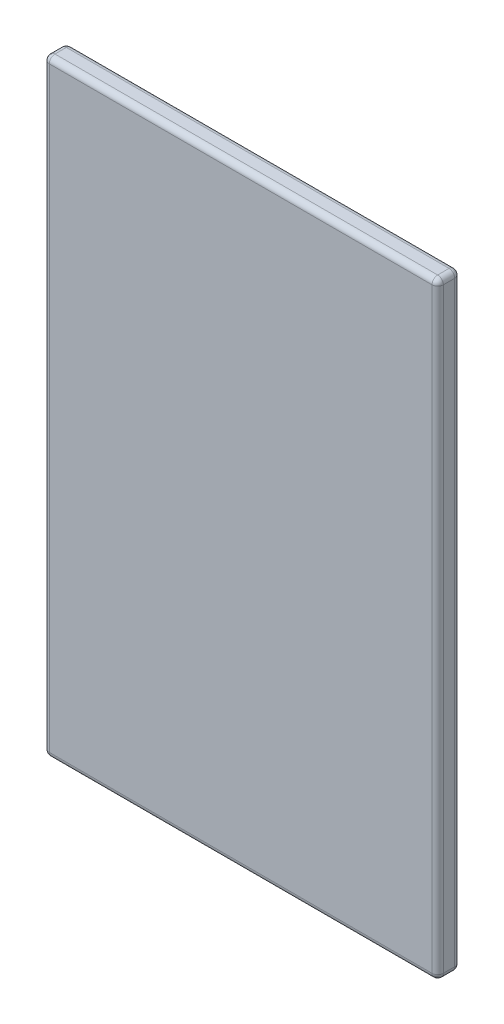
ISO-10303-21;
HEADER;
FILE_DESCRIPTION(('STEP AP214'),'2;1');
FILE_NAME('part.step','',(''),(''),'','','');
FILE_SCHEMA(('AUTOMOTIVE_DESIGN { 1 0 10303 214 1 1 1 1 }'));
ENDSEC;
DATA;
#1=APPLICATION_CONTEXT('core data for automotive mechanical design processes');
#2=APPLICATION_PROTOCOL_DEFINITION('international standard','automotive_design',2000,#1);
#3=PRODUCT_CONTEXT('',#1,'mechanical');
#4=PRODUCT('Part','Part','',(#3));
#5=PRODUCT_RELATED_PRODUCT_CATEGORY('part','',(#4));
#6=PRODUCT_DEFINITION_FORMATION('','',#4);
#7=PRODUCT_DEFINITION_CONTEXT('part definition',#1,'design');
#8=PRODUCT_DEFINITION('design','',#6,#7);
#9=PRODUCT_DEFINITION_SHAPE('','',#8);
#10=(LENGTH_UNIT() NAMED_UNIT(*) SI_UNIT(.MILLI.,.METRE.));
#11=(NAMED_UNIT(*) PLANE_ANGLE_UNIT() SI_UNIT($,.RADIAN.));
#12=(NAMED_UNIT(*) SI_UNIT($,.STERADIAN.) SOLID_ANGLE_UNIT());
#13=UNCERTAINTY_MEASURE_WITH_UNIT(LENGTH_MEASURE(1.E-05),#10,'distance_accuracy_value','');
#14=(GEOMETRIC_REPRESENTATION_CONTEXT(3) GLOBAL_UNCERTAINTY_ASSIGNED_CONTEXT((#13)) GLOBAL_UNIT_ASSIGNED_CONTEXT((#10,
#11,#12)) REPRESENTATION_CONTEXT('',''));
#15=CARTESIAN_POINT('',(0.,0.,0.));
#16=DIRECTION('',(0.,0.,1.));
#17=DIRECTION('',(1.,0.,0.));
#18=AXIS2_PLACEMENT_3D('',#15,#16,#17);
#19=CARTESIAN_POINT('',(17.35,-26.75,2.));
#20=DIRECTION('',(-1.,0.,0.));
#21=DIRECTION('',(0.,0.,1.));
#22=AXIS2_PLACEMENT_3D('',#19,#20,#21);
#23=PLANE('',#22);
#24=DIRECTION('',(0.,1.,0.));
#25=VECTOR('',#24,1.);
#26=CARTESIAN_POINT('',(17.35,-26.75,1.5));
#27=LINE('',#26,#25);
#28=CARTESIAN_POINT('',(17.35,26.25,1.5));
#29=VERTEX_POINT('',#28);
#30=CARTESIAN_POINT('',(17.35,-26.25,1.5));
#31=VERTEX_POINT('',#30);
#32=EDGE_CURVE('E44',#29,#31,#27,.F.);
#33=ORIENTED_EDGE('',*,*,#32,.T.);
#34=DIRECTION('',(0.,0.,-1.));
#35=VECTOR('',#34,1.);
#36=CARTESIAN_POINT('',(17.35,-26.25,2.));
#37=LINE('',#36,#35);
#38=CARTESIAN_POINT('',(17.35,-26.25,0.5));
#39=VERTEX_POINT('',#38);
#40=EDGE_CURVE('E11',#31,#39,#37,.T.);
#41=ORIENTED_EDGE('',*,*,#40,.T.);
#42=DIRECTION('',(0.,1.,0.));
#43=VECTOR('',#42,1.);
#44=CARTESIAN_POINT('',(17.35,26.75,0.5));
#45=LINE('',#44,#43);
#46=CARTESIAN_POINT('',(17.35,26.25,0.5));
#47=VERTEX_POINT('',#46);
#48=EDGE_CURVE('E196',#39,#47,#45,.T.);
#49=ORIENTED_EDGE('',*,*,#48,.T.);
#50=DIRECTION('',(0.,0.,-1.));
#51=VECTOR('',#50,1.);
#52=CARTESIAN_POINT('',(17.35,26.25,2.));
#53=LINE('',#52,#51);
#54=EDGE_CURVE('E55',#47,#29,#53,.F.);
#55=ORIENTED_EDGE('',*,*,#54,.T.);
#56=EDGE_LOOP('',(#33,#41,#49,#55));
#57=FACE_BOUND('',#56,.T.);
#58=ADVANCED_FACE('F35',(#57),#23,.F.);
#59=CARTESIAN_POINT('',(-17.35,26.75,2.));
#60=DIRECTION('',(0.,-1.,0.));
#61=DIRECTION('',(0.,0.,-1.));
#62=AXIS2_PLACEMENT_3D('',#59,#60,#61);
#63=PLANE('',#62);
#64=DIRECTION('',(0.,0.,-1.));
#65=VECTOR('',#64,1.);
#66=CARTESIAN_POINT('',(-16.85,26.75,2.));
#67=LINE('',#66,#65);
#68=CARTESIAN_POINT('',(-16.85,26.75,0.5));
#69=VERTEX_POINT('',#68);
#70=CARTESIAN_POINT('',(-16.85,26.75,1.5));
#71=VERTEX_POINT('',#70);
#72=EDGE_CURVE('E191',#69,#71,#67,.F.);
#73=ORIENTED_EDGE('',*,*,#72,.T.);
#74=DIRECTION('',(-1.,0.,0.));
#75=VECTOR('',#74,1.);
#76=CARTESIAN_POINT('',(-17.35,26.75,1.5));
#77=LINE('',#76,#75);
#78=CARTESIAN_POINT('',(16.85,26.75,1.5));
#79=VERTEX_POINT('',#78);
#80=EDGE_CURVE('E193',#71,#79,#77,.F.);
#81=ORIENTED_EDGE('',*,*,#80,.T.);
#82=DIRECTION('',(0.,0.,-1.));
#83=VECTOR('',#82,1.);
#84=CARTESIAN_POINT('',(16.85,26.75,2.));
#85=LINE('',#84,#83);
#86=CARTESIAN_POINT('',(16.85,26.75,0.5));
#87=VERTEX_POINT('',#86);
#88=EDGE_CURVE('E187',#79,#87,#85,.T.);
#89=ORIENTED_EDGE('',*,*,#88,.T.);
#90=DIRECTION('',(-1.,0.,0.));
#91=VECTOR('',#90,1.);
#92=CARTESIAN_POINT('',(-17.35,26.75,0.5));
#93=LINE('',#92,#91);
#94=EDGE_CURVE('E189',#87,#69,#93,.T.);
#95=ORIENTED_EDGE('',*,*,#94,.T.);
#96=EDGE_LOOP('',(#73,#81,#89,#95));
#97=FACE_BOUND('',#96,.T.);
#98=ADVANCED_FACE('F280',(#97),#63,.F.);
#99=CARTESIAN_POINT('',(-17.35,-26.75,2.));
#100=DIRECTION('',(1.,0.,0.));
#101=DIRECTION('',(0.,0.,-1.));
#102=AXIS2_PLACEMENT_3D('',#99,#100,#101);
#103=PLANE('',#102);
#104=DIRECTION('',(0.,0.,-1.));
#105=VECTOR('',#104,1.);
#106=CARTESIAN_POINT('',(-17.35,-26.25,2.));
#107=LINE('',#106,#105);
#108=CARTESIAN_POINT('',(-17.35,-26.25,0.5));
#109=VERTEX_POINT('',#108);
#110=CARTESIAN_POINT('',(-17.35,-26.25,1.5));
#111=VERTEX_POINT('',#110);
#112=EDGE_CURVE('E182',#109,#111,#107,.F.);
#113=ORIENTED_EDGE('',*,*,#112,.T.);
#114=DIRECTION('',(0.,-1.,0.));
#115=VECTOR('',#114,1.);
#116=CARTESIAN_POINT('',(-17.35,-26.75,1.5));
#117=LINE('',#116,#115);
#118=CARTESIAN_POINT('',(-17.35,26.25,1.5));
#119=VERTEX_POINT('',#118);
#120=EDGE_CURVE('E184',#111,#119,#117,.F.);
#121=ORIENTED_EDGE('',*,*,#120,.T.);
#122=DIRECTION('',(0.,0.,-1.));
#123=VECTOR('',#122,1.);
#124=CARTESIAN_POINT('',(-17.35,26.25,2.));
#125=LINE('',#124,#123);
#126=CARTESIAN_POINT('',(-17.35,26.25,0.5));
#127=VERTEX_POINT('',#126);
#128=EDGE_CURVE('E178',#119,#127,#125,.T.);
#129=ORIENTED_EDGE('',*,*,#128,.T.);
#130=DIRECTION('',(0.,-1.,0.));
#131=VECTOR('',#130,1.);
#132=CARTESIAN_POINT('',(-17.35,-26.75,0.5));
#133=LINE('',#132,#131);
#134=EDGE_CURVE('E180',#127,#109,#133,.T.);
#135=ORIENTED_EDGE('',*,*,#134,.T.);
#136=EDGE_LOOP('',(#113,#121,#129,#135));
#137=FACE_BOUND('',#136,.T.);
#138=ADVANCED_FACE('F271',(#137),#103,.F.);
#139=CARTESIAN_POINT('',(-17.35,-26.75,2.));
#140=DIRECTION('',(0.,1.,0.));
#141=DIRECTION('',(0.,0.,1.));
#142=AXIS2_PLACEMENT_3D('',#139,#140,#141);
#143=PLANE('',#142);
#144=DIRECTION('',(1.,0.,0.));
#145=VECTOR('',#144,1.);
#146=CARTESIAN_POINT('',(-17.35,-26.75,1.5));
#147=LINE('',#146,#145);
#148=CARTESIAN_POINT('',(16.85,-26.75,1.5));
#149=VERTEX_POINT('',#148);
#150=CARTESIAN_POINT('',(-16.85,-26.75,1.5));
#151=VERTEX_POINT('',#150);
#152=EDGE_CURVE('E131',#149,#151,#147,.F.);
#153=ORIENTED_EDGE('',*,*,#152,.T.);
#154=DIRECTION('',(0.,0.,-1.));
#155=VECTOR('',#154,1.);
#156=CARTESIAN_POINT('',(-16.85,-26.75,2.));
#157=LINE('',#156,#155);
#158=CARTESIAN_POINT('',(-16.85,-26.75,0.5));
#159=VERTEX_POINT('',#158);
#160=EDGE_CURVE('E167',#151,#159,#157,.T.);
#161=ORIENTED_EDGE('',*,*,#160,.T.);
#162=DIRECTION('',(1.,0.,0.));
#163=VECTOR('',#162,1.);
#164=CARTESIAN_POINT('',(17.35,-26.75,0.5));
#165=LINE('',#164,#163);
#166=CARTESIAN_POINT('',(16.85,-26.75,0.5));
#167=VERTEX_POINT('',#166);
#168=EDGE_CURVE('E160',#159,#167,#165,.T.);
#169=ORIENTED_EDGE('',*,*,#168,.T.);
#170=DIRECTION('',(0.,0.,-1.));
#171=VECTOR('',#170,1.);
#172=CARTESIAN_POINT('',(16.85,-26.75,2.));
#173=LINE('',#172,#171);
#174=EDGE_CURVE('E158',#167,#149,#173,.F.);
#175=ORIENTED_EDGE('',*,*,#174,.T.);
#176=EDGE_LOOP('',(#153,#161,#169,#175));
#177=FACE_BOUND('',#176,.T.);
#178=ADVANCED_FACE('F358',(#177),#143,.F.);
#179=CARTESIAN_POINT('',(0.,0.,2.));
#180=DIRECTION('',(0.,0.,-1.));
#181=DIRECTION('',(-1.,0.,0.));
#182=AXIS2_PLACEMENT_3D('',#179,#180,#181);
#183=PLANE('',#182);
#184=DIRECTION('',(0.,-1.,0.));
#185=VECTOR('',#184,1.);
#186=CARTESIAN_POINT('',(-16.85,0.,2.));
#187=LINE('',#186,#185);
#188=CARTESIAN_POINT('',(-16.85,26.25,2.));
#189=VERTEX_POINT('',#188);
#190=CARTESIAN_POINT('',(-16.85,-26.25,2.));
#191=VERTEX_POINT('',#190);
#192=EDGE_CURVE('E156',#189,#191,#187,.T.);
#193=ORIENTED_EDGE('',*,*,#192,.T.);
#194=DIRECTION('',(1.,0.,0.));
#195=VECTOR('',#194,1.);
#196=CARTESIAN_POINT('',(0.,-26.25,2.));
#197=LINE('',#196,#195);
#198=CARTESIAN_POINT('',(16.85,-26.25,2.));
#199=VERTEX_POINT('',#198);
#200=EDGE_CURVE('E129',#191,#199,#197,.T.);
#201=ORIENTED_EDGE('',*,*,#200,.T.);
#202=DIRECTION('',(0.,1.,0.));
#203=VECTOR('',#202,1.);
#204=CARTESIAN_POINT('',(16.85,0.,2.));
#205=LINE('',#204,#203);
#206=CARTESIAN_POINT('',(16.85,26.25,2.));
#207=VERTEX_POINT('',#206);
#208=EDGE_CURVE('E146',#199,#207,#205,.T.);
#209=ORIENTED_EDGE('',*,*,#208,.T.);
#210=DIRECTION('',(-1.,0.,0.));
#211=VECTOR('',#210,1.);
#212=CARTESIAN_POINT('',(0.,26.25,2.));
#213=LINE('',#212,#211);
#214=EDGE_CURVE('E152',#207,#189,#213,.T.);
#215=ORIENTED_EDGE('',*,*,#214,.T.);
#216=EDGE_LOOP('',(#193,#201,#209,#215));
#217=FACE_BOUND('',#216,.T.);
#218=ADVANCED_FACE('F154',(#217),#183,.F.);
#219=CARTESIAN_POINT('',(0.,0.,0.));
#220=DIRECTION('',(0.,0.,-1.));
#221=DIRECTION('',(-1.,0.,0.));
#222=AXIS2_PLACEMENT_3D('',#219,#220,#221);
#223=PLANE('',#222);
#224=DIRECTION('',(0.,1.,0.));
#225=VECTOR('',#224,1.);
#226=CARTESIAN_POINT('',(16.85,-26.75,0.));
#227=LINE('',#226,#225);
#228=CARTESIAN_POINT('',(16.85,26.25,0.));
#229=VERTEX_POINT('',#228);
#230=CARTESIAN_POINT('',(16.85,-26.25,0.));
#231=VERTEX_POINT('',#230);
#232=EDGE_CURVE('E169',#229,#231,#227,.F.);
#233=ORIENTED_EDGE('',*,*,#232,.T.);
#234=DIRECTION('',(1.,0.,0.));
#235=VECTOR('',#234,1.);
#236=CARTESIAN_POINT('',(-17.35,-26.25,0.));
#237=LINE('',#236,#235);
#238=CARTESIAN_POINT('',(-16.85,-26.25,0.));
#239=VERTEX_POINT('',#238);
#240=EDGE_CURVE('E175',#231,#239,#237,.F.);
#241=ORIENTED_EDGE('',*,*,#240,.T.);
#242=DIRECTION('',(0.,-1.,0.));
#243=VECTOR('',#242,1.);
#244=CARTESIAN_POINT('',(-16.85,26.75,0.));
#245=LINE('',#244,#243);
#246=CARTESIAN_POINT('',(-16.85,26.25,0.));
#247=VERTEX_POINT('',#246);
#248=EDGE_CURVE('E173',#239,#247,#245,.F.);
#249=ORIENTED_EDGE('',*,*,#248,.T.);
#250=DIRECTION('',(-1.,0.,0.));
#251=VECTOR('',#250,1.);
#252=CARTESIAN_POINT('',(17.35,26.25,0.));
#253=LINE('',#252,#251);
#254=EDGE_CURVE('E171',#247,#229,#253,.F.);
#255=ORIENTED_EDGE('',*,*,#254,.T.);
#256=EDGE_LOOP('',(#233,#241,#249,#255));
#257=FACE_BOUND('',#256,.T.);
#258=ADVANCED_FACE('F298',(#257),#223,.T.);
#259=CARTESIAN_POINT('',(-17.35,26.25,0.5));
#260=DIRECTION('',(1.,0.,0.));
#261=DIRECTION('',(0.,0.,-1.));
#262=AXIS2_PLACEMENT_3D('',#259,#260,#261);
#263=CYLINDRICAL_SURFACE('',#262,0.5);
#264=CARTESIAN_POINT('',(-16.85,26.25,0.5));
#265=DIRECTION('',(-1.,0.,0.));
#266=DIRECTION('',(0.,0.,1.));
#267=AXIS2_PLACEMENT_3D('',#264,#265,#266);
#268=CIRCLE('',#267,0.5);
#269=EDGE_CURVE('E39',#69,#247,#268,.T.);
#270=ORIENTED_EDGE('',*,*,#269,.F.);
#271=ORIENTED_EDGE('',*,*,#94,.F.);
#272=CARTESIAN_POINT('',(16.85,26.25,0.5));
#273=DIRECTION('',(1.,0.,0.));
#274=DIRECTION('',(0.,0.,-1.));
#275=AXIS2_PLACEMENT_3D('',#272,#273,#274);
#276=CIRCLE('',#275,0.5);
#277=EDGE_CURVE('E248',#229,#87,#276,.T.);
#278=ORIENTED_EDGE('',*,*,#277,.F.);
#279=ORIENTED_EDGE('',*,*,#254,.F.);
#280=EDGE_LOOP('',(#270,#271,#278,#279));
#281=FACE_BOUND('',#280,.T.);
#282=ADVANCED_FACE('F37',(#281),#263,.T.);
#283=CARTESIAN_POINT('',(-16.85,26.25,0.5));
#284=DIRECTION('',(0.,0.,1.));
#285=DIRECTION('',(1.,0.,0.));
#286=AXIS2_PLACEMENT_3D('',#283,#284,#285);
#287=SPHERICAL_SURFACE('',#286,0.5);
#288=CARTESIAN_POINT('',(-16.85,26.25,0.5));
#289=DIRECTION('',(0.,0.,-1.));
#290=DIRECTION('',(-1.,0.,0.));
#291=AXIS2_PLACEMENT_3D('',#288,#289,#290);
#292=CIRCLE('',#291,0.5);
#293=EDGE_CURVE('E243',#69,#127,#292,.F.);
#294=ORIENTED_EDGE('',*,*,#293,.F.);
#295=ORIENTED_EDGE('',*,*,#269,.T.);
#296=CARTESIAN_POINT('',(-16.85,26.25,0.5));
#297=DIRECTION('',(0.,1.,0.));
#298=DIRECTION('',(0.,0.,1.));
#299=AXIS2_PLACEMENT_3D('',#296,#297,#298);
#300=CIRCLE('',#299,0.5);
#301=EDGE_CURVE('E246',#127,#247,#300,.F.);
#302=ORIENTED_EDGE('',*,*,#301,.F.);
#303=EDGE_LOOP('',(#294,#295,#302));
#304=FACE_BOUND('',#303,.T.);
#305=ADVANCED_FACE('F259',(#304),#287,.T.);
#306=CARTESIAN_POINT('',(16.85,26.25,0.5));
#307=DIRECTION('',(0.,0.,1.));
#308=DIRECTION('',(1.,0.,0.));
#309=AXIS2_PLACEMENT_3D('',#306,#307,#308);
#310=SPHERICAL_SURFACE('',#309,0.5);
#311=CARTESIAN_POINT('',(16.85,26.25,0.5));
#312=DIRECTION('',(0.,1.,0.));
#313=DIRECTION('',(0.,0.,1.));
#314=AXIS2_PLACEMENT_3D('',#311,#312,#313);
#315=CIRCLE('',#314,0.5);
#316=EDGE_CURVE('E237',#229,#47,#315,.F.);
#317=ORIENTED_EDGE('',*,*,#316,.F.);
#318=ORIENTED_EDGE('',*,*,#277,.T.);
#319=CARTESIAN_POINT('',(16.85,26.25,0.5));
#320=DIRECTION('',(0.,0.,-1.));
#321=DIRECTION('',(-1.,0.,0.));
#322=AXIS2_PLACEMENT_3D('',#319,#320,#321);
#323=CIRCLE('',#322,0.5);
#324=EDGE_CURVE('E240',#47,#87,#323,.F.);
#325=ORIENTED_EDGE('',*,*,#324,.F.);
#326=EDGE_LOOP('',(#317,#318,#325));
#327=FACE_BOUND('',#326,.T.);
#328=ADVANCED_FACE('F291',(#327),#310,.T.);
#329=CARTESIAN_POINT('',(-16.85,-26.75,0.5));
#330=DIRECTION('',(0.,1.,0.));
#331=DIRECTION('',(0.,0.,1.));
#332=AXIS2_PLACEMENT_3D('',#329,#330,#331);
#333=CYLINDRICAL_SURFACE('',#332,0.5);
#334=ORIENTED_EDGE('',*,*,#301,.T.);
#335=ORIENTED_EDGE('',*,*,#248,.F.);
#336=CARTESIAN_POINT('',(-16.85,-26.25,0.5));
#337=DIRECTION('',(0.,-1.,0.));
#338=DIRECTION('',(0.,0.,-1.));
#339=AXIS2_PLACEMENT_3D('',#336,#337,#338);
#340=CIRCLE('',#339,0.5);
#341=EDGE_CURVE('E232',#109,#239,#340,.T.);
#342=ORIENTED_EDGE('',*,*,#341,.F.);
#343=ORIENTED_EDGE('',*,*,#134,.F.);
#344=EDGE_LOOP('',(#334,#335,#342,#343));
#345=FACE_BOUND('',#344,.T.);
#346=ADVANCED_FACE('F267',(#345),#333,.T.);
#347=CARTESIAN_POINT('',(-16.85,26.25,2.));
#348=DIRECTION('',(0.,0.,-1.));
#349=DIRECTION('',(-1.,0.,0.));
#350=AXIS2_PLACEMENT_3D('',#347,#348,#349);
#351=CYLINDRICAL_SURFACE('',#350,0.5);
#352=ORIENTED_EDGE('',*,*,#293,.T.);
#353=ORIENTED_EDGE('',*,*,#128,.F.);
#354=CARTESIAN_POINT('',(-16.85,26.25,1.5));
#355=DIRECTION('',(0.,0.,1.));
#356=DIRECTION('',(1.,0.,0.));
#357=AXIS2_PLACEMENT_3D('',#354,#355,#356);
#358=CIRCLE('',#357,0.5);
#359=EDGE_CURVE('E229',#71,#119,#358,.T.);
#360=ORIENTED_EDGE('',*,*,#359,.F.);
#361=ORIENTED_EDGE('',*,*,#72,.F.);
#362=EDGE_LOOP('',(#352,#353,#360,#361));
#363=FACE_BOUND('',#362,.T.);
#364=ADVANCED_FACE('F277',(#363),#351,.T.);
#365=CARTESIAN_POINT('',(0.,26.25,1.5));
#366=DIRECTION('',(-1.,0.,0.));
#367=DIRECTION('',(0.,0.,1.));
#368=AXIS2_PLACEMENT_3D('',#365,#366,#367);
#369=CYLINDRICAL_SURFACE('',#368,0.5);
#370=CARTESIAN_POINT('',(16.85,26.25,1.5));
#371=DIRECTION('',(1.,0.,0.));
#372=DIRECTION('',(0.,0.,-1.));
#373=AXIS2_PLACEMENT_3D('',#370,#371,#372);
#374=CIRCLE('',#373,0.5);
#375=EDGE_CURVE('E223',#79,#207,#374,.T.);
#376=ORIENTED_EDGE('',*,*,#375,.F.);
#377=ORIENTED_EDGE('',*,*,#80,.F.);
#378=CARTESIAN_POINT('',(-16.85,26.25,1.5));
#379=DIRECTION('',(-1.,0.,0.));
#380=DIRECTION('',(0.,0.,1.));
#381=AXIS2_PLACEMENT_3D('',#378,#379,#380);
#382=CIRCLE('',#381,0.5);
#383=EDGE_CURVE('E226',#189,#71,#382,.T.);
#384=ORIENTED_EDGE('',*,*,#383,.F.);
#385=ORIENTED_EDGE('',*,*,#214,.F.);
#386=EDGE_LOOP('',(#376,#377,#384,#385));
#387=FACE_BOUND('',#386,.T.);
#388=ADVANCED_FACE('F284',(#387),#369,.T.);
#389=CARTESIAN_POINT('',(16.85,26.25,2.));
#390=DIRECTION('',(0.,0.,-1.));
#391=DIRECTION('',(-1.,0.,0.));
#392=AXIS2_PLACEMENT_3D('',#389,#390,#391);
#393=CYLINDRICAL_SURFACE('',#392,0.5);
#394=ORIENTED_EDGE('',*,*,#324,.T.);
#395=ORIENTED_EDGE('',*,*,#88,.F.);
#396=CARTESIAN_POINT('',(16.85,26.25,1.5));
#397=DIRECTION('',(0.,0.,1.));
#398=DIRECTION('',(1.,0.,0.));
#399=AXIS2_PLACEMENT_3D('',#396,#397,#398);
#400=CIRCLE('',#399,0.5);
#401=EDGE_CURVE('E221',#29,#79,#400,.T.);
#402=ORIENTED_EDGE('',*,*,#401,.F.);
#403=ORIENTED_EDGE('',*,*,#54,.F.);
#404=EDGE_LOOP('',(#394,#395,#402,#403));
#405=FACE_BOUND('',#404,.T.);
#406=ADVANCED_FACE('F289',(#405),#393,.T.);
#407=CARTESIAN_POINT('',(16.85,-26.75,0.5));
#408=DIRECTION('',(0.,-1.,0.));
#409=DIRECTION('',(0.,0.,-1.));
#410=AXIS2_PLACEMENT_3D('',#407,#408,#409);
#411=CYLINDRICAL_SURFACE('',#410,0.5);
#412=ORIENTED_EDGE('',*,*,#316,.T.);
#413=ORIENTED_EDGE('',*,*,#48,.F.);
#414=CARTESIAN_POINT('',(16.85,-26.25,0.5));
#415=DIRECTION('',(0.,-1.,0.));
#416=DIRECTION('',(0.,0.,-1.));
#417=AXIS2_PLACEMENT_3D('',#414,#415,#416);
#418=CIRCLE('',#417,0.5);
#419=EDGE_CURVE('E218',#231,#39,#418,.T.);
#420=ORIENTED_EDGE('',*,*,#419,.F.);
#421=ORIENTED_EDGE('',*,*,#232,.F.);
#422=EDGE_LOOP('',(#412,#413,#420,#421));
#423=FACE_BOUND('',#422,.T.);
#424=ADVANCED_FACE('F295',(#423),#411,.T.);
#425=CARTESIAN_POINT('',(-17.35,-26.25,0.5));
#426=DIRECTION('',(-1.,0.,0.));
#427=DIRECTION('',(0.,0.,1.));
#428=AXIS2_PLACEMENT_3D('',#425,#426,#427);
#429=CYLINDRICAL_SURFACE('',#428,0.5);
#430=CARTESIAN_POINT('',(-16.85,-26.25,0.5));
#431=DIRECTION('',(-1.,0.,0.));
#432=DIRECTION('',(0.,0.,1.));
#433=AXIS2_PLACEMENT_3D('',#430,#431,#432);
#434=CIRCLE('',#433,0.5);
#435=EDGE_CURVE('E234',#239,#159,#434,.T.);
#436=ORIENTED_EDGE('',*,*,#435,.F.);
#437=ORIENTED_EDGE('',*,*,#240,.F.);
#438=CARTESIAN_POINT('',(16.85,-26.25,0.5));
#439=DIRECTION('',(1.,0.,0.));
#440=DIRECTION('',(0.,0.,-1.));
#441=AXIS2_PLACEMENT_3D('',#438,#439,#440);
#442=CIRCLE('',#441,0.5);
#443=EDGE_CURVE('E215',#167,#231,#442,.T.);
#444=ORIENTED_EDGE('',*,*,#443,.F.);
#445=ORIENTED_EDGE('',*,*,#168,.F.);
#446=EDGE_LOOP('',(#436,#437,#444,#445));
#447=FACE_BOUND('',#446,.T.);
#448=ADVANCED_FACE('F302',(#447),#429,.T.);
#449=CARTESIAN_POINT('',(-16.85,-26.25,0.5));
#450=DIRECTION('',(0.,0.,1.));
#451=DIRECTION('',(1.,0.,0.));
#452=AXIS2_PLACEMENT_3D('',#449,#450,#451);
#453=SPHERICAL_SURFACE('',#452,0.5);
#454=ORIENTED_EDGE('',*,*,#341,.T.);
#455=ORIENTED_EDGE('',*,*,#435,.T.);
#456=CARTESIAN_POINT('',(-16.85,-26.25,0.5));
#457=DIRECTION('',(0.,0.,-1.));
#458=DIRECTION('',(-1.,0.,0.));
#459=AXIS2_PLACEMENT_3D('',#456,#457,#458);
#460=CIRCLE('',#459,0.5);
#461=EDGE_CURVE('E212',#109,#159,#460,.F.);
#462=ORIENTED_EDGE('',*,*,#461,.F.);
#463=EDGE_LOOP('',(#454,#455,#462));
#464=FACE_BOUND('',#463,.T.);
#465=ADVANCED_FACE('F306',(#464),#453,.T.);
#466=CARTESIAN_POINT('',(-16.85,26.25,1.5));
#467=DIRECTION('',(0.,0.,1.));
#468=DIRECTION('',(1.,0.,0.));
#469=AXIS2_PLACEMENT_3D('',#466,#467,#468);
#470=SPHERICAL_SURFACE('',#469,0.5);
#471=ORIENTED_EDGE('',*,*,#383,.T.);
#472=ORIENTED_EDGE('',*,*,#359,.T.);
#473=CARTESIAN_POINT('',(-16.85,26.25,1.5));
#474=DIRECTION('',(0.,1.,0.));
#475=DIRECTION('',(0.,0.,1.));
#476=AXIS2_PLACEMENT_3D('',#473,#474,#475);
#477=CIRCLE('',#476,0.5);
#478=EDGE_CURVE('E210',#189,#119,#477,.F.);
#479=ORIENTED_EDGE('',*,*,#478,.F.);
#480=EDGE_LOOP('',(#471,#472,#479));
#481=FACE_BOUND('',#480,.T.);
#482=ADVANCED_FACE('F317',(#481),#470,.T.);
#483=CARTESIAN_POINT('',(16.85,26.25,1.5));
#484=DIRECTION('',(0.,0.,1.));
#485=DIRECTION('',(1.,0.,0.));
#486=AXIS2_PLACEMENT_3D('',#483,#484,#485);
#487=SPHERICAL_SURFACE('',#486,0.5);
#488=ORIENTED_EDGE('',*,*,#401,.T.);
#489=ORIENTED_EDGE('',*,*,#375,.T.);
#490=CARTESIAN_POINT('',(16.85,26.25,1.5));
#491=DIRECTION('',(0.,1.,0.));
#492=DIRECTION('',(0.,0.,1.));
#493=AXIS2_PLACEMENT_3D('',#490,#491,#492);
#494=CIRCLE('',#493,0.5);
#495=EDGE_CURVE('E149',#29,#207,#494,.F.);
#496=ORIENTED_EDGE('',*,*,#495,.F.);
#497=EDGE_LOOP('',(#488,#489,#496));
#498=FACE_BOUND('',#497,.T.);
#499=ADVANCED_FACE('F319',(#498),#487,.T.);
#500=CARTESIAN_POINT('',(16.85,-26.25,0.5));
#501=DIRECTION('',(0.,0.,1.));
#502=DIRECTION('',(1.,0.,0.));
#503=AXIS2_PLACEMENT_3D('',#500,#501,#502);
#504=SPHERICAL_SURFACE('',#503,0.5);
#505=ORIENTED_EDGE('',*,*,#443,.T.);
#506=ORIENTED_EDGE('',*,*,#419,.T.);
#507=CARTESIAN_POINT('',(16.85,-26.25,0.5));
#508=DIRECTION('',(0.,0.,-1.));
#509=DIRECTION('',(-1.,0.,0.));
#510=AXIS2_PLACEMENT_3D('',#507,#508,#509);
#511=CIRCLE('',#510,0.5);
#512=EDGE_CURVE('E207',#167,#39,#511,.F.);
#513=ORIENTED_EDGE('',*,*,#512,.F.);
#514=EDGE_LOOP('',(#505,#506,#513));
#515=FACE_BOUND('',#514,.T.);
#516=ADVANCED_FACE('F325',(#515),#504,.T.);
#517=CARTESIAN_POINT('',(-16.85,-26.25,2.));
#518=DIRECTION('',(0.,0.,-1.));
#519=DIRECTION('',(-1.,0.,0.));
#520=AXIS2_PLACEMENT_3D('',#517,#518,#519);
#521=CYLINDRICAL_SURFACE('',#520,0.5);
#522=ORIENTED_EDGE('',*,*,#461,.T.);
#523=ORIENTED_EDGE('',*,*,#160,.F.);
#524=CARTESIAN_POINT('',(-16.85,-26.25,1.5));
#525=DIRECTION('',(0.,0.,1.));
#526=DIRECTION('',(1.,0.,0.));
#527=AXIS2_PLACEMENT_3D('',#524,#525,#526);
#528=CIRCLE('',#527,0.5);
#529=EDGE_CURVE('E204',#111,#151,#528,.T.);
#530=ORIENTED_EDGE('',*,*,#529,.F.);
#531=ORIENTED_EDGE('',*,*,#112,.F.);
#532=EDGE_LOOP('',(#522,#523,#530,#531));
#533=FACE_BOUND('',#532,.T.);
#534=ADVANCED_FACE('F309',(#533),#521,.T.);
#535=CARTESIAN_POINT('',(-16.85,0.,1.5));
#536=DIRECTION('',(0.,-1.,0.));
#537=DIRECTION('',(0.,0.,-1.));
#538=AXIS2_PLACEMENT_3D('',#535,#536,#537);
#539=CYLINDRICAL_SURFACE('',#538,0.5);
#540=ORIENTED_EDGE('',*,*,#478,.T.);
#541=ORIENTED_EDGE('',*,*,#120,.F.);
#542=CARTESIAN_POINT('',(-16.85,-26.25,1.5));
#543=DIRECTION('',(0.,-1.,0.));
#544=DIRECTION('',(0.,0.,-1.));
#545=AXIS2_PLACEMENT_3D('',#542,#543,#544);
#546=CIRCLE('',#545,0.5);
#547=EDGE_CURVE('E143',#191,#111,#546,.T.);
#548=ORIENTED_EDGE('',*,*,#547,.F.);
#549=ORIENTED_EDGE('',*,*,#192,.F.);
#550=EDGE_LOOP('',(#540,#541,#548,#549));
#551=FACE_BOUND('',#550,.T.);
#552=ADVANCED_FACE('F315',(#551),#539,.T.);
#553=CARTESIAN_POINT('',(16.85,0.,1.5));
#554=DIRECTION('',(0.,1.,0.));
#555=DIRECTION('',(0.,0.,1.));
#556=AXIS2_PLACEMENT_3D('',#553,#554,#555);
#557=CYLINDRICAL_SURFACE('',#556,0.5);
#558=ORIENTED_EDGE('',*,*,#495,.T.);
#559=ORIENTED_EDGE('',*,*,#208,.F.);
#560=CARTESIAN_POINT('',(16.85,-26.25,1.5));
#561=DIRECTION('',(0.,-1.,0.));
#562=DIRECTION('',(0.,0.,-1.));
#563=AXIS2_PLACEMENT_3D('',#560,#561,#562);
#564=CIRCLE('',#563,0.5);
#565=EDGE_CURVE('E137',#31,#199,#564,.T.);
#566=ORIENTED_EDGE('',*,*,#565,.F.);
#567=ORIENTED_EDGE('',*,*,#32,.F.);
#568=EDGE_LOOP('',(#558,#559,#566,#567));
#569=FACE_BOUND('',#568,.T.);
#570=ADVANCED_FACE('F147',(#569),#557,.T.);
#571=CARTESIAN_POINT('',(16.85,-26.25,2.));
#572=DIRECTION('',(0.,0.,-1.));
#573=DIRECTION('',(-1.,0.,0.));
#574=AXIS2_PLACEMENT_3D('',#571,#572,#573);
#575=CYLINDRICAL_SURFACE('',#574,0.5);
#576=ORIENTED_EDGE('',*,*,#512,.T.);
#577=ORIENTED_EDGE('',*,*,#40,.F.);
#578=CARTESIAN_POINT('',(16.85,-26.25,1.5));
#579=DIRECTION('',(0.,0.,1.));
#580=DIRECTION('',(1.,0.,0.));
#581=AXIS2_PLACEMENT_3D('',#578,#579,#580);
#582=CIRCLE('',#581,0.5);
#583=EDGE_CURVE('E141',#149,#31,#582,.T.);
#584=ORIENTED_EDGE('',*,*,#583,.F.);
#585=ORIENTED_EDGE('',*,*,#174,.F.);
#586=EDGE_LOOP('',(#576,#577,#584,#585));
#587=FACE_BOUND('',#586,.T.);
#588=ADVANCED_FACE('F342',(#587),#575,.T.);
#589=CARTESIAN_POINT('',(-16.85,-26.25,1.5));
#590=DIRECTION('',(0.,0.,1.));
#591=DIRECTION('',(1.,0.,0.));
#592=AXIS2_PLACEMENT_3D('',#589,#590,#591);
#593=SPHERICAL_SURFACE('',#592,0.5);
#594=ORIENTED_EDGE('',*,*,#547,.T.);
#595=ORIENTED_EDGE('',*,*,#529,.T.);
#596=CARTESIAN_POINT('',(-16.85,-26.25,1.5));
#597=DIRECTION('',(-1.,0.,0.));
#598=DIRECTION('',(0.,0.,1.));
#599=AXIS2_PLACEMENT_3D('',#596,#597,#598);
#600=CIRCLE('',#599,0.5);
#601=EDGE_CURVE('E134',#191,#151,#600,.F.);
#602=ORIENTED_EDGE('',*,*,#601,.F.);
#603=EDGE_LOOP('',(#594,#595,#602));
#604=FACE_BOUND('',#603,.T.);
#605=ADVANCED_FACE('F313',(#604),#593,.T.);
#606=CARTESIAN_POINT('',(16.85,-26.25,1.5));
#607=DIRECTION('',(0.,0.,1.));
#608=DIRECTION('',(1.,0.,0.));
#609=AXIS2_PLACEMENT_3D('',#606,#607,#608);
#610=SPHERICAL_SURFACE('',#609,0.5);
#611=ORIENTED_EDGE('',*,*,#583,.T.);
#612=ORIENTED_EDGE('',*,*,#565,.T.);
#613=CARTESIAN_POINT('',(16.85,-26.25,1.5));
#614=DIRECTION('',(1.,0.,0.));
#615=DIRECTION('',(0.,0.,-1.));
#616=AXIS2_PLACEMENT_3D('',#613,#614,#615);
#617=CIRCLE('',#616,0.5);
#618=EDGE_CURVE('E125',#149,#199,#617,.F.);
#619=ORIENTED_EDGE('',*,*,#618,.F.);
#620=EDGE_LOOP('',(#611,#612,#619));
#621=FACE_BOUND('',#620,.T.);
#622=ADVANCED_FACE('F139',(#621),#610,.T.);
#623=CARTESIAN_POINT('',(0.,-26.25,1.5));
#624=DIRECTION('',(1.,0.,0.));
#625=DIRECTION('',(0.,0.,-1.));
#626=AXIS2_PLACEMENT_3D('',#623,#624,#625);
#627=CYLINDRICAL_SURFACE('',#626,0.5);
#628=ORIENTED_EDGE('',*,*,#601,.T.);
#629=ORIENTED_EDGE('',*,*,#152,.F.);
#630=ORIENTED_EDGE('',*,*,#618,.T.);
#631=ORIENTED_EDGE('',*,*,#200,.F.);
#632=EDGE_LOOP('',(#628,#629,#630,#631));
#633=FACE_BOUND('',#632,.T.);
#634=ADVANCED_FACE('F127',(#633),#627,.T.);
#635=CLOSED_SHELL('',(#58,#98,#138,#178,#218,#258,#282,#305,#328,#346,#364,#388,#406,#424,#448,
#465,#482,#499,#516,#534,#552,#570,#588,#605,#622,#634));
#636=MANIFOLD_SOLID_BREP('B2',#635);
#637=ADVANCED_BREP_SHAPE_REPRESENTATION('',(#18,#636),#14);
#638=SHAPE_DEFINITION_REPRESENTATION(#9,#637);
ENDSEC;
END-ISO-10303-21;
